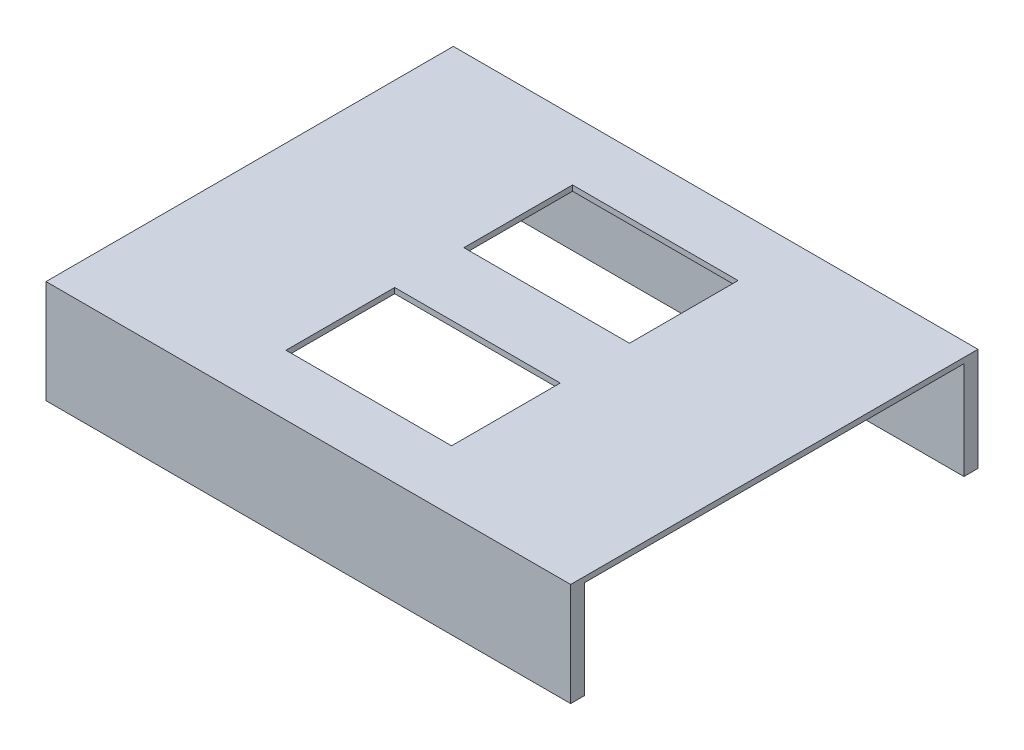
ISO-10303-21;
HEADER;
FILE_DESCRIPTION(('STEP AP214'),'2;1');
FILE_NAME('part.step','',(''),(''),'','','');
FILE_SCHEMA(('AUTOMOTIVE_DESIGN { 1 0 10303 214 1 1 1 1 }'));
ENDSEC;
DATA;
#1=APPLICATION_CONTEXT('core data for automotive mechanical design processes');
#2=APPLICATION_PROTOCOL_DEFINITION('international standard','automotive_design',2000,#1);
#3=PRODUCT_CONTEXT('',#1,'mechanical');
#4=PRODUCT('Part','Part','',(#3));
#5=PRODUCT_RELATED_PRODUCT_CATEGORY('part','',(#4));
#6=PRODUCT_DEFINITION_FORMATION('','',#4);
#7=PRODUCT_DEFINITION_CONTEXT('part definition',#1,'design');
#8=PRODUCT_DEFINITION('design','',#6,#7);
#9=PRODUCT_DEFINITION_SHAPE('','',#8);
#10=(LENGTH_UNIT() NAMED_UNIT(*) SI_UNIT(.MILLI.,.METRE.));
#11=(NAMED_UNIT(*) PLANE_ANGLE_UNIT() SI_UNIT($,.RADIAN.));
#12=(NAMED_UNIT(*) SI_UNIT($,.STERADIAN.) SOLID_ANGLE_UNIT());
#13=UNCERTAINTY_MEASURE_WITH_UNIT(LENGTH_MEASURE(1.E-05),#10,'distance_accuracy_value','');
#14=(GEOMETRIC_REPRESENTATION_CONTEXT(3) GLOBAL_UNCERTAINTY_ASSIGNED_CONTEXT((#13)) GLOBAL_UNIT_ASSIGNED_CONTEXT((#10,
#11,#12)) REPRESENTATION_CONTEXT('',''));
#15=CARTESIAN_POINT('',(0.,0.,0.));
#16=DIRECTION('',(0.,0.,1.));
#17=DIRECTION('',(1.,0.,0.));
#18=AXIS2_PLACEMENT_3D('',#15,#16,#17);
#19=CARTESIAN_POINT('',(0.,0.,0.));
#20=DIRECTION('',(0.,-1.,0.));
#21=DIRECTION('',(0.,0.,-1.));
#22=AXIS2_PLACEMENT_3D('',#19,#20,#21);
#23=PLANE('',#22);
#24=DIRECTION('',(1.,0.,0.));
#25=VECTOR('',#24,1.);
#26=CARTESIAN_POINT('',(0.,0.,-88.7695943163527));
#27=LINE('',#26,#25);
#28=CARTESIAN_POINT('',(-216.482649842271,0.,-88.7695943163527));
#29=VERTEX_POINT('',#28);
#30=CARTESIAN_POINT('',(266.517350157729,0.,-88.7695943163527));
#31=VERTEX_POINT('',#30);
#32=EDGE_CURVE('E251',#29,#31,#27,.T.);
#33=ORIENTED_EDGE('',*,*,#32,.F.);
#34=DIRECTION('',(0.,0.,1.));
#35=VECTOR('',#34,1.);
#36=CARTESIAN_POINT('',(-216.482649842271,0.,-101.735015772871));
#37=LINE('',#36,#35);
#38=CARTESIAN_POINT('',(-216.482649842271,0.,-101.735015772871));
#39=VERTEX_POINT('',#38);
#40=EDGE_CURVE('E219',#39,#29,#37,.T.);
#41=ORIENTED_EDGE('',*,*,#40,.F.);
#42=DIRECTION('',(1.,0.,0.));
#43=VECTOR('',#42,1.);
#44=CARTESIAN_POINT('',(-216.482649842271,0.,-101.735015772871));
#45=LINE('',#44,#43);
#46=CARTESIAN_POINT('',(266.517350157729,0.,-101.735015772871));
#47=VERTEX_POINT('',#46);
#48=EDGE_CURVE('E234',#39,#47,#45,.T.);
#49=ORIENTED_EDGE('',*,*,#48,.T.);
#50=DIRECTION('',(0.,0.,1.));
#51=VECTOR('',#50,1.);
#52=CARTESIAN_POINT('',(266.517350157729,0.,-101.735015772871));
#53=LINE('',#52,#51);
#54=EDGE_CURVE('E231',#47,#31,#53,.T.);
#55=ORIENTED_EDGE('',*,*,#54,.T.);
#56=EDGE_LOOP('',(#33,#41,#49,#55));
#57=FACE_BOUND('',#56,.T.);
#58=ADVANCED_FACE('F33',(#57),#23,.T.);
#59=CARTESIAN_POINT('',(-216.482649842271,95.,273.264984227129));
#60=DIRECTION('',(0.,0.,-1.));
#61=DIRECTION('',(-1.,0.,0.));
#62=AXIS2_PLACEMENT_3D('',#59,#60,#61);
#63=PLANE('',#62);
#64=DIRECTION('',(1.,0.,0.));
#65=VECTOR('',#64,1.);
#66=CARTESIAN_POINT('',(-216.482649842271,0.,273.264984227129));
#67=LINE('',#66,#65);
#68=CARTESIAN_POINT('',(-216.482649842271,0.,273.264984227129));
#69=VERTEX_POINT('',#68);
#70=CARTESIAN_POINT('',(266.517350157729,0.,273.264984227129));
#71=VERTEX_POINT('',#70);
#72=EDGE_CURVE('E215',#69,#71,#67,.T.);
#73=ORIENTED_EDGE('',*,*,#72,.T.);
#74=DIRECTION('',(0.,-1.,0.));
#75=VECTOR('',#74,1.);
#76=CARTESIAN_POINT('',(266.517350157729,95.,273.264984227129));
#77=LINE('',#76,#75);
#78=CARTESIAN_POINT('',(266.517350157729,95.,273.264984227129));
#79=VERTEX_POINT('',#78);
#80=EDGE_CURVE('E246',#79,#71,#77,.T.);
#81=ORIENTED_EDGE('',*,*,#80,.F.);
#82=DIRECTION('',(1.,0.,0.));
#83=VECTOR('',#82,1.);
#84=CARTESIAN_POINT('',(-216.482649842271,95.,273.264984227129));
#85=LINE('',#84,#83);
#86=CARTESIAN_POINT('',(-216.482649842271,95.,273.264984227129));
#87=VERTEX_POINT('',#86);
#88=EDGE_CURVE('E216',#87,#79,#85,.T.);
#89=ORIENTED_EDGE('',*,*,#88,.F.);
#90=DIRECTION('',(0.,-1.,0.));
#91=VECTOR('',#90,1.);
#92=CARTESIAN_POINT('',(-216.482649842271,95.,273.264984227129));
#93=LINE('',#92,#91);
#94=EDGE_CURVE('E227',#87,#69,#93,.T.);
#95=ORIENTED_EDGE('',*,*,#94,.T.);
#96=EDGE_LOOP('',(#73,#81,#89,#95));
#97=FACE_BOUND('',#96,.T.);
#98=ADVANCED_FACE('F35',(#97),#63,.F.);
#99=CARTESIAN_POINT('',(266.517350157729,95.,-101.735015772871));
#100=DIRECTION('',(1.,0.,0.));
#101=DIRECTION('',(0.,0.,-1.));
#102=AXIS2_PLACEMENT_3D('',#99,#100,#101);
#103=PLANE('',#102);
#104=DIRECTION('',(0.,1.,0.));
#105=VECTOR('',#104,1.);
#106=CARTESIAN_POINT('',(266.517350157729,95.,-88.7695943163527));
#107=LINE('',#106,#105);
#108=CARTESIAN_POINT('',(266.517350157729,90.,-88.7695943163527));
#109=VERTEX_POINT('',#108);
#110=EDGE_CURVE('E211',#31,#109,#107,.T.);
#111=ORIENTED_EDGE('',*,*,#110,.F.);
#112=ORIENTED_EDGE('',*,*,#54,.F.);
#113=DIRECTION('',(0.,-1.,0.));
#114=VECTOR('',#113,1.);
#115=CARTESIAN_POINT('',(266.517350157729,95.,-101.735015772871));
#116=LINE('',#115,#114);
#117=CARTESIAN_POINT('',(266.517350157729,95.,-101.735015772871));
#118=VERTEX_POINT('',#117);
#119=EDGE_CURVE('E244',#118,#47,#116,.T.);
#120=ORIENTED_EDGE('',*,*,#119,.F.);
#121=DIRECTION('',(0.,0.,1.));
#122=VECTOR('',#121,1.);
#123=CARTESIAN_POINT('',(266.517350157729,95.,-101.735015772871));
#124=LINE('',#123,#122);
#125=EDGE_CURVE('E218',#118,#79,#124,.T.);
#126=ORIENTED_EDGE('',*,*,#125,.T.);
#127=ORIENTED_EDGE('',*,*,#80,.T.);
#128=CARTESIAN_POINT('',(266.517350157729,0.,260.310984227129));
#129=VERTEX_POINT('',#128);
#130=EDGE_CURVE('E230',#129,#71,#53,.T.);
#131=ORIENTED_EDGE('',*,*,#130,.F.);
#132=DIRECTION('',(0.,-1.,0.));
#133=VECTOR('',#132,1.);
#134=CARTESIAN_POINT('',(266.517350157729,95.,260.310984227129));
#135=LINE('',#134,#133);
#136=CARTESIAN_POINT('',(266.517350157729,90.,260.310984227129));
#137=VERTEX_POINT('',#136);
#138=EDGE_CURVE('E208',#137,#129,#135,.T.);
#139=ORIENTED_EDGE('',*,*,#138,.F.);
#140=DIRECTION('',(0.,0.,1.));
#141=VECTOR('',#140,1.);
#142=CARTESIAN_POINT('',(266.517350157729,90.,-101.735015772871));
#143=LINE('',#142,#141);
#144=EDGE_CURVE('E213',#109,#137,#143,.T.);
#145=ORIENTED_EDGE('',*,*,#144,.F.);
#146=EDGE_LOOP('',(#111,#112,#120,#126,#127,#131,#139,#145));
#147=FACE_BOUND('',#146,.T.);
#148=ADVANCED_FACE('F294',(#147),#103,.T.);
#149=CARTESIAN_POINT('',(-216.482649842271,95.,-101.735015772871));
#150=DIRECTION('',(0.,0.,-1.));
#151=DIRECTION('',(-1.,0.,0.));
#152=AXIS2_PLACEMENT_3D('',#149,#150,#151);
#153=PLANE('',#152);
#154=ORIENTED_EDGE('',*,*,#48,.F.);
#155=DIRECTION('',(0.,-1.,0.));
#156=VECTOR('',#155,1.);
#157=CARTESIAN_POINT('',(-216.482649842271,95.,-101.735015772871));
#158=LINE('',#157,#156);
#159=CARTESIAN_POINT('',(-216.482649842271,95.,-101.735015772871));
#160=VERTEX_POINT('',#159);
#161=EDGE_CURVE('E242',#160,#39,#158,.T.);
#162=ORIENTED_EDGE('',*,*,#161,.F.);
#163=DIRECTION('',(1.,0.,0.));
#164=VECTOR('',#163,1.);
#165=CARTESIAN_POINT('',(-216.482649842271,95.,-101.735015772871));
#166=LINE('',#165,#164);
#167=EDGE_CURVE('E222',#160,#118,#166,.T.);
#168=ORIENTED_EDGE('',*,*,#167,.T.);
#169=ORIENTED_EDGE('',*,*,#119,.T.);
#170=EDGE_LOOP('',(#154,#162,#168,#169));
#171=FACE_BOUND('',#170,.T.);
#172=ADVANCED_FACE('F336',(#171),#153,.T.);
#173=CARTESIAN_POINT('',(-216.482649842271,95.,-101.735015772871));
#174=DIRECTION('',(1.,0.,0.));
#175=DIRECTION('',(0.,0.,-1.));
#176=AXIS2_PLACEMENT_3D('',#173,#174,#175);
#177=PLANE('',#176);
#178=ORIENTED_EDGE('',*,*,#40,.T.);
#179=DIRECTION('',(0.,-1.,0.));
#180=VECTOR('',#179,1.);
#181=CARTESIAN_POINT('',(-216.482649842271,90.,-88.7695943163527));
#182=LINE('',#181,#180);
#183=CARTESIAN_POINT('',(-216.482649842271,90.,-88.7695943163527));
#184=VERTEX_POINT('',#183);
#185=EDGE_CURVE('E177',#184,#29,#182,.T.);
#186=ORIENTED_EDGE('',*,*,#185,.F.);
#187=DIRECTION('',(0.,0.,-1.));
#188=VECTOR('',#187,1.);
#189=CARTESIAN_POINT('',(-216.482649842271,90.,-88.7695943163527));
#190=LINE('',#189,#188);
#191=CARTESIAN_POINT('',(-216.482649842271,90.,260.310984227129));
#192=VERTEX_POINT('',#191);
#193=EDGE_CURVE('E202',#192,#184,#190,.T.);
#194=ORIENTED_EDGE('',*,*,#193,.F.);
#195=DIRECTION('',(0.,1.,0.));
#196=VECTOR('',#195,1.);
#197=CARTESIAN_POINT('',(-216.482649842271,90.,260.310984227129));
#198=LINE('',#197,#196);
#199=CARTESIAN_POINT('',(-216.482649842271,0.,260.310984227129));
#200=VERTEX_POINT('',#199);
#201=EDGE_CURVE('E199',#200,#192,#198,.T.);
#202=ORIENTED_EDGE('',*,*,#201,.F.);
#203=EDGE_CURVE('E237',#200,#69,#37,.T.);
#204=ORIENTED_EDGE('',*,*,#203,.T.);
#205=ORIENTED_EDGE('',*,*,#94,.F.);
#206=DIRECTION('',(0.,0.,1.));
#207=VECTOR('',#206,1.);
#208=CARTESIAN_POINT('',(-216.482649842271,95.,-101.735015772871));
#209=LINE('',#208,#207);
#210=EDGE_CURVE('E225',#160,#87,#209,.T.);
#211=ORIENTED_EDGE('',*,*,#210,.F.);
#212=ORIENTED_EDGE('',*,*,#161,.T.);
#213=EDGE_LOOP('',(#178,#186,#194,#202,#204,#205,#211,#212));
#214=FACE_BOUND('',#213,.T.);
#215=ADVANCED_FACE('F308',(#214),#177,.F.);
#216=CARTESIAN_POINT('',(0.,95.,0.));
#217=DIRECTION('',(0.,-1.,0.));
#218=DIRECTION('',(0.,0.,-1.));
#219=AXIS2_PLACEMENT_3D('',#216,#217,#218);
#220=PLANE('',#219);
#221=DIRECTION('',(0.,0.,1.));
#222=VECTOR('',#221,1.);
#223=CARTESIAN_POINT('',(101.271350157729,95.,-46.1090157728706));
#224=LINE('',#223,#222);
#225=CARTESIAN_POINT('',(101.271350157729,95.,-46.1090157728706));
#226=VERTEX_POINT('',#225);
#227=CARTESIAN_POINT('',(101.271350157729,95.,53.8909842271294));
#228=VERTEX_POINT('',#227);
#229=EDGE_CURVE('E163',#226,#228,#224,.T.);
#230=ORIENTED_EDGE('',*,*,#229,.T.);
#231=DIRECTION('',(1.,0.,0.));
#232=VECTOR('',#231,1.);
#233=CARTESIAN_POINT('',(-51.1286498422712,95.,53.8909842271294));
#234=LINE('',#233,#232);
#235=CARTESIAN_POINT('',(-51.1286498422712,95.,53.8909842271294));
#236=VERTEX_POINT('',#235);
#237=EDGE_CURVE('E48',#236,#228,#234,.T.);
#238=ORIENTED_EDGE('',*,*,#237,.F.);
#239=DIRECTION('',(0.,0.,1.));
#240=VECTOR('',#239,1.);
#241=CARTESIAN_POINT('',(-51.1286498422713,95.,-46.1090157728706));
#242=LINE('',#241,#240);
#243=CARTESIAN_POINT('',(-51.1286498422713,95.,-46.1090157728706));
#244=VERTEX_POINT('',#243);
#245=EDGE_CURVE('E170',#244,#236,#242,.T.);
#246=ORIENTED_EDGE('',*,*,#245,.F.);
#247=DIRECTION('',(1.,0.,0.));
#248=VECTOR('',#247,1.);
#249=CARTESIAN_POINT('',(-51.1286498422713,95.,-46.1090157728706));
#250=LINE('',#249,#248);
#251=EDGE_CURVE('E153',#244,#226,#250,.T.);
#252=ORIENTED_EDGE('',*,*,#251,.T.);
#253=EDGE_LOOP('',(#230,#238,#246,#252));
#254=FACE_BOUND('',#253,.T.);
#255=DIRECTION('',(0.,0.,1.));
#256=VECTOR('',#255,1.);
#257=CARTESIAN_POINT('',(101.144350157729,95.,117.478369345019));
#258=LINE('',#257,#256);
#259=CARTESIAN_POINT('',(101.144350157729,95.,117.478369345019));
#260=VERTEX_POINT('',#259);
#261=CARTESIAN_POINT('',(101.144350157729,95.,217.554369345019));
#262=VERTEX_POINT('',#261);
#263=EDGE_CURVE('E194',#260,#262,#258,.T.);
#264=ORIENTED_EDGE('',*,*,#263,.T.);
#265=DIRECTION('',(1.,0.,0.));
#266=VECTOR('',#265,1.);
#267=CARTESIAN_POINT('',(-51.2556498422713,95.,217.554369345019));
#268=LINE('',#267,#266);
#269=CARTESIAN_POINT('',(-51.2556498422713,95.,217.554369345019));
#270=VERTEX_POINT('',#269);
#271=EDGE_CURVE('E56',#270,#262,#268,.T.);
#272=ORIENTED_EDGE('',*,*,#271,.F.);
#273=DIRECTION('',(0.,0.,1.));
#274=VECTOR('',#273,1.);
#275=CARTESIAN_POINT('',(-51.2556498422713,95.,117.478369345019));
#276=LINE('',#275,#274);
#277=CARTESIAN_POINT('',(-51.2556498422713,95.,117.478369345019));
#278=VERTEX_POINT('',#277);
#279=EDGE_CURVE('E182',#278,#270,#276,.T.);
#280=ORIENTED_EDGE('',*,*,#279,.F.);
#281=DIRECTION('',(1.,0.,0.));
#282=VECTOR('',#281,1.);
#283=CARTESIAN_POINT('',(-51.2556498422713,95.,117.478369345019));
#284=LINE('',#283,#282);
#285=EDGE_CURVE('E191',#278,#260,#284,.T.);
#286=ORIENTED_EDGE('',*,*,#285,.T.);
#287=EDGE_LOOP('',(#264,#272,#280,#286));
#288=FACE_BOUND('',#287,.T.);
#289=ORIENTED_EDGE('',*,*,#88,.T.);
#290=ORIENTED_EDGE('',*,*,#125,.F.);
#291=ORIENTED_EDGE('',*,*,#167,.F.);
#292=ORIENTED_EDGE('',*,*,#210,.T.);
#293=EDGE_LOOP('',(#289,#290,#291,#292));
#294=FACE_BOUND('',#293,.T.);
#295=ADVANCED_FACE('F167',(#254,#288,#294),#220,.F.);
#296=DIRECTION('',(-1.,0.,0.));
#297=VECTOR('',#296,1.);
#298=CARTESIAN_POINT('',(0.,0.,260.310984227129));
#299=LINE('',#298,#297);
#300=EDGE_CURVE('E249',#129,#200,#299,.T.);
#301=ORIENTED_EDGE('',*,*,#300,.F.);
#302=ORIENTED_EDGE('',*,*,#130,.T.);
#303=ORIENTED_EDGE('',*,*,#72,.F.);
#304=ORIENTED_EDGE('',*,*,#203,.F.);
#305=EDGE_LOOP('',(#301,#302,#303,#304));
#306=FACE_BOUND('',#305,.T.);
#307=ADVANCED_FACE('F290',(#306),#23,.T.);
#308=CARTESIAN_POINT('',(314.635350157729,90.,-88.7695943163527));
#309=DIRECTION('',(0.,0.,-1.));
#310=DIRECTION('',(-1.,0.,0.));
#311=AXIS2_PLACEMENT_3D('',#308,#309,#310);
#312=PLANE('',#311);
#313=ORIENTED_EDGE('',*,*,#110,.T.);
#314=DIRECTION('',(-1.,0.,0.));
#315=VECTOR('',#314,1.);
#316=CARTESIAN_POINT('',(314.635350157729,90.,-88.7695943163527));
#317=LINE('',#316,#315);
#318=EDGE_CURVE('E206',#109,#184,#317,.T.);
#319=ORIENTED_EDGE('',*,*,#318,.T.);
#320=ORIENTED_EDGE('',*,*,#185,.T.);
#321=ORIENTED_EDGE('',*,*,#32,.T.);
#322=EDGE_LOOP('',(#313,#319,#320,#321));
#323=FACE_BOUND('',#322,.T.);
#324=ADVANCED_FACE('F300',(#323),#312,.F.);
#325=CARTESIAN_POINT('',(314.635350157729,90.,-88.7695943163527));
#326=DIRECTION('',(0.,1.,0.));
#327=DIRECTION('',(0.,0.,1.));
#328=AXIS2_PLACEMENT_3D('',#325,#326,#327);
#329=PLANE('',#328);
#330=DIRECTION('',(0.,0.,1.));
#331=VECTOR('',#330,1.);
#332=CARTESIAN_POINT('',(-51.1286498422713,90.,-88.7695943163526));
#333=LINE('',#332,#331);
#334=CARTESIAN_POINT('',(-51.1286498422713,90.,-46.1090157728706));
#335=VERTEX_POINT('',#334);
#336=CARTESIAN_POINT('',(-51.1286498422712,90.,53.8909842271294));
#337=VERTEX_POINT('',#336);
#338=EDGE_CURVE('E41',#335,#337,#333,.T.);
#339=ORIENTED_EDGE('',*,*,#338,.T.);
#340=DIRECTION('',(1.,0.,0.));
#341=VECTOR('',#340,1.);
#342=CARTESIAN_POINT('',(314.635350157729,90.,53.8909842271294));
#343=LINE('',#342,#341);
#344=CARTESIAN_POINT('',(101.271350157729,90.,53.8909842271294));
#345=VERTEX_POINT('',#344);
#346=EDGE_CURVE('E11',#337,#345,#343,.T.);
#347=ORIENTED_EDGE('',*,*,#346,.T.);
#348=DIRECTION('',(0.,0.,1.));
#349=VECTOR('',#348,1.);
#350=CARTESIAN_POINT('',(101.271350157729,90.,-88.7695943163527));
#351=LINE('',#350,#349);
#352=CARTESIAN_POINT('',(101.271350157729,90.,-46.1090157728706));
#353=VERTEX_POINT('',#352);
#354=EDGE_CURVE('E264',#353,#345,#351,.T.);
#355=ORIENTED_EDGE('',*,*,#354,.F.);
#356=DIRECTION('',(1.,0.,0.));
#357=VECTOR('',#356,1.);
#358=CARTESIAN_POINT('',(314.635350157729,90.,-46.1090157728706));
#359=LINE('',#358,#357);
#360=EDGE_CURVE('E156',#335,#353,#359,.T.);
#361=ORIENTED_EDGE('',*,*,#360,.F.);
#362=EDGE_LOOP('',(#339,#347,#355,#361));
#363=FACE_BOUND('',#362,.T.);
#364=DIRECTION('',(0.,0.,1.));
#365=VECTOR('',#364,1.);
#366=CARTESIAN_POINT('',(-51.2556498422713,90.,-88.7695943163526));
#367=LINE('',#366,#365);
#368=CARTESIAN_POINT('',(-51.2556498422713,90.,117.478369345019));
#369=VERTEX_POINT('',#368);
#370=CARTESIAN_POINT('',(-51.2556498422713,90.,217.554369345019));
#371=VERTEX_POINT('',#370);
#372=EDGE_CURVE('E258',#369,#371,#367,.T.);
#373=ORIENTED_EDGE('',*,*,#372,.T.);
#374=DIRECTION('',(1.,0.,0.));
#375=VECTOR('',#374,1.);
#376=CARTESIAN_POINT('',(314.635350157729,90.,217.554369345019));
#377=LINE('',#376,#375);
#378=CARTESIAN_POINT('',(101.144350157729,90.,217.554369345019));
#379=VERTEX_POINT('',#378);
#380=EDGE_CURVE('E261',#371,#379,#377,.T.);
#381=ORIENTED_EDGE('',*,*,#380,.T.);
#382=DIRECTION('',(0.,0.,1.));
#383=VECTOR('',#382,1.);
#384=CARTESIAN_POINT('',(101.144350157729,90.,-88.7695943163527));
#385=LINE('',#384,#383);
#386=CARTESIAN_POINT('',(101.144350157729,90.,117.478369345019));
#387=VERTEX_POINT('',#386);
#388=EDGE_CURVE('E253',#387,#379,#385,.T.);
#389=ORIENTED_EDGE('',*,*,#388,.F.);
#390=DIRECTION('',(1.,0.,0.));
#391=VECTOR('',#390,1.);
#392=CARTESIAN_POINT('',(314.635350157729,90.,117.478369345019));
#393=LINE('',#392,#391);
#394=EDGE_CURVE('E255',#369,#387,#393,.T.);
#395=ORIENTED_EDGE('',*,*,#394,.F.);
#396=EDGE_LOOP('',(#373,#381,#389,#395));
#397=FACE_BOUND('',#396,.T.);
#398=ORIENTED_EDGE('',*,*,#144,.T.);
#399=DIRECTION('',(-1.,0.,0.));
#400=VECTOR('',#399,1.);
#401=CARTESIAN_POINT('',(314.635350157729,90.,260.310984227129));
#402=LINE('',#401,#400);
#403=EDGE_CURVE('E205',#137,#192,#402,.T.);
#404=ORIENTED_EDGE('',*,*,#403,.T.);
#405=ORIENTED_EDGE('',*,*,#193,.T.);
#406=ORIENTED_EDGE('',*,*,#318,.F.);
#407=EDGE_LOOP('',(#398,#404,#405,#406));
#408=FACE_BOUND('',#407,.T.);
#409=ADVANCED_FACE('F268',(#363,#397,#408),#329,.F.);
#410=CARTESIAN_POINT('',(314.635350157729,90.,260.310984227129));
#411=DIRECTION('',(0.,0.,1.));
#412=DIRECTION('',(1.,0.,0.));
#413=AXIS2_PLACEMENT_3D('',#410,#411,#412);
#414=PLANE('',#413);
#415=ORIENTED_EDGE('',*,*,#138,.T.);
#416=ORIENTED_EDGE('',*,*,#300,.T.);
#417=ORIENTED_EDGE('',*,*,#201,.T.);
#418=ORIENTED_EDGE('',*,*,#403,.F.);
#419=EDGE_LOOP('',(#415,#416,#417,#418));
#420=FACE_BOUND('',#419,.T.);
#421=ADVANCED_FACE('F329',(#420),#414,.F.);
#422=CARTESIAN_POINT('',(-51.2556498422713,-436.118,217.554369345019));
#423=DIRECTION('',(0.,0.,1.));
#424=DIRECTION('',(1.,0.,0.));
#425=AXIS2_PLACEMENT_3D('',#422,#423,#424);
#426=PLANE('',#425);
#427=DIRECTION('',(0.,1.,0.));
#428=VECTOR('',#427,1.);
#429=CARTESIAN_POINT('',(-51.2556498422713,-436.118,217.554369345019));
#430=LINE('',#429,#428);
#431=EDGE_CURVE('E187',#371,#270,#430,.T.);
#432=ORIENTED_EDGE('',*,*,#431,.T.);
#433=ORIENTED_EDGE('',*,*,#271,.T.);
#434=DIRECTION('',(0.,1.,0.));
#435=VECTOR('',#434,1.);
#436=CARTESIAN_POINT('',(101.144350157729,-436.118,217.554369345019));
#437=LINE('',#436,#435);
#438=EDGE_CURVE('E180',#379,#262,#437,.T.);
#439=ORIENTED_EDGE('',*,*,#438,.F.);
#440=ORIENTED_EDGE('',*,*,#380,.F.);
#441=EDGE_LOOP('',(#432,#433,#439,#440));
#442=FACE_BOUND('',#441,.T.);
#443=ADVANCED_FACE('F388',(#442),#426,.F.);
#444=CARTESIAN_POINT('',(-51.2556498422713,-436.118,117.478369345019));
#445=DIRECTION('',(-1.,0.,0.));
#446=DIRECTION('',(0.,0.,1.));
#447=AXIS2_PLACEMENT_3D('',#444,#445,#446);
#448=PLANE('',#447);
#449=DIRECTION('',(0.,1.,0.));
#450=VECTOR('',#449,1.);
#451=CARTESIAN_POINT('',(-51.2556498422713,-436.118,117.478369345019));
#452=LINE('',#451,#450);
#453=EDGE_CURVE('E185',#369,#278,#452,.T.);
#454=ORIENTED_EDGE('',*,*,#453,.T.);
#455=ORIENTED_EDGE('',*,*,#279,.T.);
#456=ORIENTED_EDGE('',*,*,#431,.F.);
#457=ORIENTED_EDGE('',*,*,#372,.F.);
#458=EDGE_LOOP('',(#454,#455,#456,#457));
#459=FACE_BOUND('',#458,.T.);
#460=ADVANCED_FACE('F395',(#459),#448,.F.);
#461=CARTESIAN_POINT('',(-51.2556498422713,-436.118,117.478369345019));
#462=DIRECTION('',(0.,0.,1.));
#463=DIRECTION('',(1.,0.,0.));
#464=AXIS2_PLACEMENT_3D('',#461,#462,#463);
#465=PLANE('',#464);
#466=ORIENTED_EDGE('',*,*,#394,.T.);
#467=DIRECTION('',(0.,1.,0.));
#468=VECTOR('',#467,1.);
#469=CARTESIAN_POINT('',(101.144350157729,-436.118,117.478369345019));
#470=LINE('',#469,#468);
#471=EDGE_CURVE('E183',#387,#260,#470,.T.);
#472=ORIENTED_EDGE('',*,*,#471,.T.);
#473=ORIENTED_EDGE('',*,*,#285,.F.);
#474=ORIENTED_EDGE('',*,*,#453,.F.);
#475=EDGE_LOOP('',(#466,#472,#473,#474));
#476=FACE_BOUND('',#475,.T.);
#477=ADVANCED_FACE('F282',(#476),#465,.T.);
#478=CARTESIAN_POINT('',(101.144350157729,-436.118,117.478369345019));
#479=DIRECTION('',(-1.,0.,0.));
#480=DIRECTION('',(0.,0.,1.));
#481=AXIS2_PLACEMENT_3D('',#478,#479,#480);
#482=PLANE('',#481);
#483=ORIENTED_EDGE('',*,*,#388,.T.);
#484=ORIENTED_EDGE('',*,*,#438,.T.);
#485=ORIENTED_EDGE('',*,*,#263,.F.);
#486=ORIENTED_EDGE('',*,*,#471,.F.);
#487=EDGE_LOOP('',(#483,#484,#485,#486));
#488=FACE_BOUND('',#487,.T.);
#489=ADVANCED_FACE('F275',(#488),#482,.T.);
#490=CARTESIAN_POINT('',(-51.1286498422712,-436.118,53.8909842271294));
#491=DIRECTION('',(0.,0.,1.));
#492=DIRECTION('',(1.,0.,0.));
#493=AXIS2_PLACEMENT_3D('',#490,#491,#492);
#494=PLANE('',#493);
#495=DIRECTION('',(0.,1.,0.));
#496=VECTOR('',#495,1.);
#497=CARTESIAN_POINT('',(-51.1286498422712,-436.118,53.8909842271294));
#498=LINE('',#497,#496);
#499=EDGE_CURVE('E175',#337,#236,#498,.T.);
#500=ORIENTED_EDGE('',*,*,#499,.T.);
#501=ORIENTED_EDGE('',*,*,#237,.T.);
#502=DIRECTION('',(0.,1.,0.));
#503=VECTOR('',#502,1.);
#504=CARTESIAN_POINT('',(101.271350157729,-436.118,53.8909842271294));
#505=LINE('',#504,#503);
#506=EDGE_CURVE('E160',#345,#228,#505,.T.);
#507=ORIENTED_EDGE('',*,*,#506,.F.);
#508=ORIENTED_EDGE('',*,*,#346,.F.);
#509=EDGE_LOOP('',(#500,#501,#507,#508));
#510=FACE_BOUND('',#509,.T.);
#511=ADVANCED_FACE('F273',(#510),#494,.F.);
#512=CARTESIAN_POINT('',(-51.1286498422713,-436.118,-46.1090157728706));
#513=DIRECTION('',(-1.,0.,0.));
#514=DIRECTION('',(0.,0.,1.));
#515=AXIS2_PLACEMENT_3D('',#512,#513,#514);
#516=PLANE('',#515);
#517=DIRECTION('',(0.,1.,0.));
#518=VECTOR('',#517,1.);
#519=CARTESIAN_POINT('',(-51.1286498422713,-436.118,-46.1090157728706));
#520=LINE('',#519,#518);
#521=EDGE_CURVE('E159',#335,#244,#520,.T.);
#522=ORIENTED_EDGE('',*,*,#521,.T.);
#523=ORIENTED_EDGE('',*,*,#245,.T.);
#524=ORIENTED_EDGE('',*,*,#499,.F.);
#525=ORIENTED_EDGE('',*,*,#338,.F.);
#526=EDGE_LOOP('',(#522,#523,#524,#525));
#527=FACE_BOUND('',#526,.T.);
#528=ADVANCED_FACE('F272',(#527),#516,.F.);
#529=CARTESIAN_POINT('',(-51.1286498422713,-436.118,-46.1090157728706));
#530=DIRECTION('',(0.,0.,1.));
#531=DIRECTION('',(1.,0.,0.));
#532=AXIS2_PLACEMENT_3D('',#529,#530,#531);
#533=PLANE('',#532);
#534=ORIENTED_EDGE('',*,*,#360,.T.);
#535=DIRECTION('',(0.,1.,0.));
#536=VECTOR('',#535,1.);
#537=CARTESIAN_POINT('',(101.271350157729,-436.118,-46.1090157728706));
#538=LINE('',#537,#536);
#539=EDGE_CURVE('E148',#353,#226,#538,.T.);
#540=ORIENTED_EDGE('',*,*,#539,.T.);
#541=ORIENTED_EDGE('',*,*,#251,.F.);
#542=ORIENTED_EDGE('',*,*,#521,.F.);
#543=EDGE_LOOP('',(#534,#540,#541,#542));
#544=FACE_BOUND('',#543,.T.);
#545=ADVANCED_FACE('F150',(#544),#533,.T.);
#546=CARTESIAN_POINT('',(101.271350157729,-436.118,-46.1090157728706));
#547=DIRECTION('',(-1.,0.,0.));
#548=DIRECTION('',(0.,0.,1.));
#549=AXIS2_PLACEMENT_3D('',#546,#547,#548);
#550=PLANE('',#549);
#551=ORIENTED_EDGE('',*,*,#354,.T.);
#552=ORIENTED_EDGE('',*,*,#506,.T.);
#553=ORIENTED_EDGE('',*,*,#229,.F.);
#554=ORIENTED_EDGE('',*,*,#539,.F.);
#555=EDGE_LOOP('',(#551,#552,#553,#554));
#556=FACE_BOUND('',#555,.T.);
#557=ADVANCED_FACE('F164',(#556),#550,.T.);
#558=CLOSED_SHELL('',(#58,#98,#148,#172,#215,#295,#307,#324,#409,#421,#443,#460,#477,#489,#511,
#528,#545,#557));
#559=MANIFOLD_SOLID_BREP('B2',#558);
#560=ADVANCED_BREP_SHAPE_REPRESENTATION('',(#18,#559),#14);
#561=SHAPE_DEFINITION_REPRESENTATION(#9,#560);
ENDSEC;
END-ISO-10303-21;
